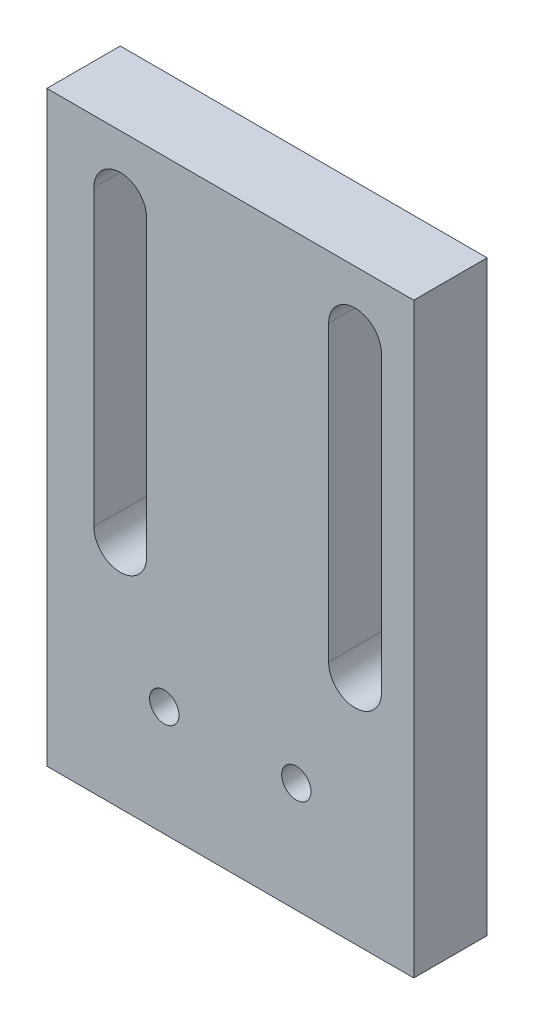
ISO-10303-21;
HEADER;
FILE_DESCRIPTION(('STEP AP214'),'2;1');
FILE_NAME('part.step','',(''),(''),'','','');
FILE_SCHEMA(('AUTOMOTIVE_DESIGN { 1 0 10303 214 1 1 1 1 }'));
ENDSEC;
DATA;
#1=APPLICATION_CONTEXT('core data for automotive mechanical design processes');
#2=APPLICATION_PROTOCOL_DEFINITION('international standard','automotive_design',2000,#1);
#3=PRODUCT_CONTEXT('',#1,'mechanical');
#4=PRODUCT('Part','Part','',(#3));
#5=PRODUCT_RELATED_PRODUCT_CATEGORY('part','',(#4));
#6=PRODUCT_DEFINITION_FORMATION('','',#4);
#7=PRODUCT_DEFINITION_CONTEXT('part definition',#1,'design');
#8=PRODUCT_DEFINITION('design','',#6,#7);
#9=PRODUCT_DEFINITION_SHAPE('','',#8);
#10=(LENGTH_UNIT() NAMED_UNIT(*) SI_UNIT(.MILLI.,.METRE.));
#11=(NAMED_UNIT(*) PLANE_ANGLE_UNIT() SI_UNIT($,.RADIAN.));
#12=(NAMED_UNIT(*) SI_UNIT($,.STERADIAN.) SOLID_ANGLE_UNIT());
#13=UNCERTAINTY_MEASURE_WITH_UNIT(LENGTH_MEASURE(1.E-05),#10,'distance_accuracy_value','');
#14=(GEOMETRIC_REPRESENTATION_CONTEXT(3) GLOBAL_UNCERTAINTY_ASSIGNED_CONTEXT((#13)) GLOBAL_UNIT_ASSIGNED_CONTEXT((#10,
#11,#12)) REPRESENTATION_CONTEXT('',''));
#15=CARTESIAN_POINT('',(0.,0.,0.));
#16=DIRECTION('',(0.,0.,1.));
#17=DIRECTION('',(1.,0.,0.));
#18=AXIS2_PLACEMENT_3D('',#15,#16,#17);
#19=CARTESIAN_POINT('',(-4.99999999999999,-4.24721189591077,5.));
#20=DIRECTION('',(0.,0.,-1.));
#21=DIRECTION('',(-1.,0.,0.));
#22=AXIS2_PLACEMENT_3D('',#19,#20,#21);
#23=CYLINDRICAL_SURFACE('',#22,1.);
#24=CARTESIAN_POINT('',(-4.99999999999999,-4.24721189591077,5.));
#25=DIRECTION('',(0.,0.,1.));
#26=DIRECTION('',(1.,0.,0.));
#27=AXIS2_PLACEMENT_3D('',#24,#25,#26);
#28=CIRCLE('',#27,1.);
#29=CARTESIAN_POINT('',(-3.99999999999999,-4.24721189591077,5.));
#30=VERTEX_POINT('',#29);
#31=EDGE_CURVE('E306',#30,#30,#28,.T.);
#32=ORIENTED_EDGE('',*,*,#31,.T.);
#33=EDGE_LOOP('',(#32));
#34=FACE_BOUND('',#33,.T.);
#35=CARTESIAN_POINT('',(-4.99999999999999,-4.24721189591077,2.5));
#36=DIRECTION('',(0.,0.,-1.));
#37=DIRECTION('',(-1.,0.,0.));
#38=AXIS2_PLACEMENT_3D('',#35,#36,#37);
#39=CIRCLE('',#38,1.);
#40=CARTESIAN_POINT('',(-5.99999999999999,-4.24721189591077,2.5));
#41=VERTEX_POINT('',#40);
#42=EDGE_CURVE('E37',#41,#41,#39,.T.);
#43=ORIENTED_EDGE('',*,*,#42,.T.);
#44=EDGE_LOOP('',(#43));
#45=FACE_BOUND('',#44,.T.);
#46=ADVANCED_FACE('F33',(#34,#45),#23,.F.);
#47=CARTESIAN_POINT('',(4.00000000000001,-4.24721189591077,5.));
#48=DIRECTION('',(0.,0.,-1.));
#49=DIRECTION('',(-1.,0.,0.));
#50=AXIS2_PLACEMENT_3D('',#47,#48,#49);
#51=CYLINDRICAL_SURFACE('',#50,1.);
#52=CARTESIAN_POINT('',(4.00000000000001,-4.24721189591077,5.));
#53=DIRECTION('',(0.,0.,1.));
#54=DIRECTION('',(1.,0.,0.));
#55=AXIS2_PLACEMENT_3D('',#52,#53,#54);
#56=CIRCLE('',#55,1.);
#57=CARTESIAN_POINT('',(5.00000000000001,-4.24721189591077,5.));
#58=VERTEX_POINT('',#57);
#59=EDGE_CURVE('E303',#58,#58,#56,.T.);
#60=ORIENTED_EDGE('',*,*,#59,.T.);
#61=EDGE_LOOP('',(#60));
#62=FACE_BOUND('',#61,.T.);
#63=CARTESIAN_POINT('',(4.00000000000001,-4.24721189591077,2.5));
#64=DIRECTION('',(0.,0.,-1.));
#65=DIRECTION('',(-1.,0.,0.));
#66=AXIS2_PLACEMENT_3D('',#63,#64,#65);
#67=CIRCLE('',#66,1.);
#68=CARTESIAN_POINT('',(3.00000000000001,-4.24721189591077,2.5));
#69=VERTEX_POINT('',#68);
#70=EDGE_CURVE('E235',#69,#69,#67,.T.);
#71=ORIENTED_EDGE('',*,*,#70,.T.);
#72=EDGE_LOOP('',(#71));
#73=FACE_BOUND('',#72,.T.);
#74=ADVANCED_FACE('F337',(#62,#73),#51,.F.);
#75=CARTESIAN_POINT('',(0.,0.,5.));
#76=DIRECTION('',(0.,0.,1.));
#77=DIRECTION('',(1.,0.,0.));
#78=AXIS2_PLACEMENT_3D('',#75,#76,#77);
#79=PLANE('',#78);
#80=ORIENTED_EDGE('',*,*,#31,.F.);
#81=EDGE_LOOP('',(#80));
#82=FACE_BOUND('',#81,.T.);
#83=DIRECTION('',(0.,-1.,0.));
#84=VECTOR('',#83,1.);
#85=CARTESIAN_POINT('',(-13.,28.2527881040892,5.));
#86=LINE('',#85,#84);
#87=CARTESIAN_POINT('',(-13.,28.2527881040892,5.));
#88=VERTEX_POINT('',#87);
#89=CARTESIAN_POINT('',(-13.,-11.7472118959108,5.));
#90=VERTEX_POINT('',#89);
#91=EDGE_CURVE('E310',#88,#90,#86,.T.);
#92=ORIENTED_EDGE('',*,*,#91,.T.);
#93=DIRECTION('',(1.,0.,0.));
#94=VECTOR('',#93,1.);
#95=CARTESIAN_POINT('',(-13.,-11.7472118959108,5.));
#96=LINE('',#95,#94);
#97=CARTESIAN_POINT('',(12.,-11.7472118959108,5.));
#98=VERTEX_POINT('',#97);
#99=EDGE_CURVE('E313',#90,#98,#96,.T.);
#100=ORIENTED_EDGE('',*,*,#99,.T.);
#101=DIRECTION('',(0.,1.,0.));
#102=VECTOR('',#101,1.);
#103=CARTESIAN_POINT('',(12.,28.2527881040892,5.));
#104=LINE('',#103,#102);
#105=CARTESIAN_POINT('',(12.,28.2527881040892,5.));
#106=VERTEX_POINT('',#105);
#107=EDGE_CURVE('E316',#98,#106,#104,.T.);
#108=ORIENTED_EDGE('',*,*,#107,.T.);
#109=DIRECTION('',(-1.,0.,0.));
#110=VECTOR('',#109,1.);
#111=CARTESIAN_POINT('',(-13.,28.2527881040892,5.));
#112=LINE('',#111,#110);
#113=EDGE_CURVE('E318',#106,#88,#112,.T.);
#114=ORIENTED_EDGE('',*,*,#113,.T.);
#115=EDGE_LOOP('',(#92,#100,#108,#114));
#116=FACE_BOUND('',#115,.T.);
#117=ORIENTED_EDGE('',*,*,#59,.F.);
#118=EDGE_LOOP('',(#117));
#119=FACE_BOUND('',#118,.T.);
#120=DIRECTION('',(0.,-1.,0.));
#121=VECTOR('',#120,1.);
#122=CARTESIAN_POINT('',(-9.8,23.9935041029267,5.));
#123=LINE('',#122,#121);
#124=CARTESIAN_POINT('',(-9.8,23.9935041029267,5.));
#125=VERTEX_POINT('',#124);
#126=CARTESIAN_POINT('',(-9.8,3.99350410292669,5.));
#127=VERTEX_POINT('',#126);
#128=EDGE_CURVE('E275',#125,#127,#123,.T.);
#129=ORIENTED_EDGE('',*,*,#128,.F.);
#130=CARTESIAN_POINT('',(-8.,23.9935041029267,5.));
#131=DIRECTION('',(0.,0.,1.));
#132=DIRECTION('',(1.,0.,0.));
#133=AXIS2_PLACEMENT_3D('',#130,#131,#132);
#134=CIRCLE('',#133,1.8);
#135=CARTESIAN_POINT('',(-6.2,23.9935041029267,5.));
#136=VERTEX_POINT('',#135);
#137=EDGE_CURVE('E273',#136,#125,#134,.T.);
#138=ORIENTED_EDGE('',*,*,#137,.F.);
#139=DIRECTION('',(0.,1.,0.));
#140=VECTOR('',#139,1.);
#141=CARTESIAN_POINT('',(-6.2,23.9935041029267,5.));
#142=LINE('',#141,#140);
#143=CARTESIAN_POINT('',(-6.19999999999999,3.99350410292669,5.));
#144=VERTEX_POINT('',#143);
#145=EDGE_CURVE('E281',#144,#136,#142,.T.);
#146=ORIENTED_EDGE('',*,*,#145,.F.);
#147=CARTESIAN_POINT('',(-7.99999999999999,3.99350410292669,5.));
#148=DIRECTION('',(0.,0.,1.));
#149=DIRECTION('',(1.,0.,0.));
#150=AXIS2_PLACEMENT_3D('',#147,#148,#149);
#151=CIRCLE('',#150,1.8);
#152=EDGE_CURVE('E278',#127,#144,#151,.T.);
#153=ORIENTED_EDGE('',*,*,#152,.F.);
#154=EDGE_LOOP('',(#129,#138,#146,#153));
#155=FACE_BOUND('',#154,.T.);
#156=DIRECTION('',(0.,-1.,0.));
#157=VECTOR('',#156,1.);
#158=CARTESIAN_POINT('',(6.2,23.9935041029267,5.));
#159=LINE('',#158,#157);
#160=CARTESIAN_POINT('',(6.2,23.9935041029267,5.));
#161=VERTEX_POINT('',#160);
#162=CARTESIAN_POINT('',(6.2,3.99350410292669,5.));
#163=VERTEX_POINT('',#162);
#164=EDGE_CURVE('E243',#161,#163,#159,.T.);
#165=ORIENTED_EDGE('',*,*,#164,.F.);
#166=CARTESIAN_POINT('',(8.,23.9935041029267,5.));
#167=DIRECTION('',(0.,0.,1.));
#168=DIRECTION('',(-1.,0.,0.));
#169=AXIS2_PLACEMENT_3D('',#166,#167,#168);
#170=CIRCLE('',#169,1.8);
#171=CARTESIAN_POINT('',(9.8,23.9935041029267,5.));
#172=VERTEX_POINT('',#171);
#173=EDGE_CURVE('E241',#172,#161,#170,.T.);
#174=ORIENTED_EDGE('',*,*,#173,.F.);
#175=DIRECTION('',(0.,1.,0.));
#176=VECTOR('',#175,1.);
#177=CARTESIAN_POINT('',(9.8,23.9935041029267,5.));
#178=LINE('',#177,#176);
#179=CARTESIAN_POINT('',(9.8,3.99350410292669,5.));
#180=VERTEX_POINT('',#179);
#181=EDGE_CURVE('E249',#180,#172,#178,.T.);
#182=ORIENTED_EDGE('',*,*,#181,.F.);
#183=CARTESIAN_POINT('',(8.,3.99350410292669,5.));
#184=DIRECTION('',(0.,0.,1.));
#185=DIRECTION('',(-1.,0.,0.));
#186=AXIS2_PLACEMENT_3D('',#183,#184,#185);
#187=CIRCLE('',#186,1.8);
#188=EDGE_CURVE('E246',#163,#180,#187,.T.);
#189=ORIENTED_EDGE('',*,*,#188,.F.);
#190=EDGE_LOOP('',(#165,#174,#182,#189));
#191=FACE_BOUND('',#190,.T.);
#192=ADVANCED_FACE('F361',(#82,#116,#119,#155,#191),#79,.T.);
#193=CARTESIAN_POINT('',(0.,0.,0.));
#194=DIRECTION('',(0.,0.,1.));
#195=DIRECTION('',(1.,0.,0.));
#196=AXIS2_PLACEMENT_3D('',#193,#194,#195);
#197=PLANE('',#196);
#198=DIRECTION('',(1.,0.,0.));
#199=VECTOR('',#198,1.);
#200=CARTESIAN_POINT('',(-1.89999999999999,-1.14721189591077,0.));
#201=LINE('',#200,#199);
#202=CARTESIAN_POINT('',(-8.09999999999999,-1.14721189591077,0.));
#203=VERTEX_POINT('',#202);
#204=CARTESIAN_POINT('',(-1.89999999999999,-1.14721189591077,0.));
#205=VERTEX_POINT('',#204);
#206=EDGE_CURVE('E201',#203,#205,#201,.T.);
#207=ORIENTED_EDGE('',*,*,#206,.F.);
#208=DIRECTION('',(0.,1.,0.));
#209=VECTOR('',#208,1.);
#210=CARTESIAN_POINT('',(-8.09999999999999,-1.14721189591077,0.));
#211=LINE('',#210,#209);
#212=CARTESIAN_POINT('',(-8.09999999999999,-7.34721189591077,0.));
#213=VERTEX_POINT('',#212);
#214=EDGE_CURVE('E50',#213,#203,#211,.T.);
#215=ORIENTED_EDGE('',*,*,#214,.F.);
#216=DIRECTION('',(-1.,0.,0.));
#217=VECTOR('',#216,1.);
#218=CARTESIAN_POINT('',(-1.9,-7.34721189591077,0.));
#219=LINE('',#218,#217);
#220=CARTESIAN_POINT('',(-1.9,-7.34721189591077,0.));
#221=VERTEX_POINT('',#220);
#222=EDGE_CURVE('E192',#221,#213,#219,.T.);
#223=ORIENTED_EDGE('',*,*,#222,.F.);
#224=DIRECTION('',(0.,-1.,0.));
#225=VECTOR('',#224,1.);
#226=CARTESIAN_POINT('',(-1.89999999999999,-1.14721189591077,0.));
#227=LINE('',#226,#225);
#228=EDGE_CURVE('E195',#205,#221,#227,.T.);
#229=ORIENTED_EDGE('',*,*,#228,.F.);
#230=EDGE_LOOP('',(#207,#215,#223,#229));
#231=FACE_BOUND('',#230,.T.);
#232=DIRECTION('',(1.,0.,0.));
#233=VECTOR('',#232,1.);
#234=CARTESIAN_POINT('',(7.10000000000001,-1.14721189591077,0.));
#235=LINE('',#234,#233);
#236=CARTESIAN_POINT('',(0.900000000000006,-1.14721189591077,0.));
#237=VERTEX_POINT('',#236);
#238=CARTESIAN_POINT('',(7.10000000000001,-1.14721189591077,0.));
#239=VERTEX_POINT('',#238);
#240=EDGE_CURVE('E225',#237,#239,#235,.T.);
#241=ORIENTED_EDGE('',*,*,#240,.F.);
#242=DIRECTION('',(0.,1.,0.));
#243=VECTOR('',#242,1.);
#244=CARTESIAN_POINT('',(0.900000000000006,-1.14721189591077,0.));
#245=LINE('',#244,#243);
#246=CARTESIAN_POINT('',(0.900000000000005,-7.34721189591077,0.));
#247=VERTEX_POINT('',#246);
#248=EDGE_CURVE('E58',#247,#237,#245,.T.);
#249=ORIENTED_EDGE('',*,*,#248,.F.);
#250=DIRECTION('',(-1.,0.,0.));
#251=VECTOR('',#250,1.);
#252=CARTESIAN_POINT('',(7.1,-7.34721189591077,0.));
#253=LINE('',#252,#251);
#254=CARTESIAN_POINT('',(7.1,-7.34721189591077,0.));
#255=VERTEX_POINT('',#254);
#256=EDGE_CURVE('E214',#255,#247,#253,.T.);
#257=ORIENTED_EDGE('',*,*,#256,.F.);
#258=DIRECTION('',(0.,-1.,0.));
#259=VECTOR('',#258,1.);
#260=CARTESIAN_POINT('',(7.10000000000001,-1.14721189591077,0.));
#261=LINE('',#260,#259);
#262=EDGE_CURVE('E228',#239,#255,#261,.T.);
#263=ORIENTED_EDGE('',*,*,#262,.F.);
#264=EDGE_LOOP('',(#241,#249,#257,#263));
#265=FACE_BOUND('',#264,.T.);
#266=CARTESIAN_POINT('',(-8.,23.9935041029267,0.));
#267=DIRECTION('',(0.,0.,1.));
#268=DIRECTION('',(1.,0.,0.));
#269=AXIS2_PLACEMENT_3D('',#266,#267,#268);
#270=CIRCLE('',#269,1.8);
#271=CARTESIAN_POINT('',(-6.2,23.9935041029267,0.));
#272=VERTEX_POINT('',#271);
#273=CARTESIAN_POINT('',(-9.8,23.9935041029267,0.));
#274=VERTEX_POINT('',#273);
#275=EDGE_CURVE('E272',#272,#274,#270,.T.);
#276=ORIENTED_EDGE('',*,*,#275,.T.);
#277=DIRECTION('',(0.,-1.,0.));
#278=VECTOR('',#277,1.);
#279=CARTESIAN_POINT('',(-9.8,23.9935041029267,0.));
#280=LINE('',#279,#278);
#281=CARTESIAN_POINT('',(-9.8,3.99350410292669,0.));
#282=VERTEX_POINT('',#281);
#283=EDGE_CURVE('E286',#274,#282,#280,.T.);
#284=ORIENTED_EDGE('',*,*,#283,.T.);
#285=CARTESIAN_POINT('',(-7.99999999999999,3.99350410292669,0.));
#286=DIRECTION('',(0.,0.,1.));
#287=DIRECTION('',(1.,0.,0.));
#288=AXIS2_PLACEMENT_3D('',#285,#286,#287);
#289=CIRCLE('',#288,1.8);
#290=CARTESIAN_POINT('',(-6.19999999999999,3.99350410292669,0.));
#291=VERTEX_POINT('',#290);
#292=EDGE_CURVE('E289',#282,#291,#289,.T.);
#293=ORIENTED_EDGE('',*,*,#292,.T.);
#294=DIRECTION('',(0.,1.,0.));
#295=VECTOR('',#294,1.);
#296=CARTESIAN_POINT('',(-6.2,23.9935041029267,0.));
#297=LINE('',#296,#295);
#298=EDGE_CURVE('E276',#291,#272,#297,.T.);
#299=ORIENTED_EDGE('',*,*,#298,.T.);
#300=EDGE_LOOP('',(#276,#284,#293,#299));
#301=FACE_BOUND('',#300,.T.);
#302=DIRECTION('',(0.,-1.,0.));
#303=VECTOR('',#302,1.);
#304=CARTESIAN_POINT('',(-13.,28.2527881040892,0.));
#305=LINE('',#304,#303);
#306=CARTESIAN_POINT('',(-13.,28.2527881040892,0.));
#307=VERTEX_POINT('',#306);
#308=CARTESIAN_POINT('',(-13.,-11.7472118959108,0.));
#309=VERTEX_POINT('',#308);
#310=EDGE_CURVE('E309',#307,#309,#305,.T.);
#311=ORIENTED_EDGE('',*,*,#310,.F.);
#312=DIRECTION('',(-1.,0.,0.));
#313=VECTOR('',#312,1.);
#314=CARTESIAN_POINT('',(-13.,28.2527881040892,0.));
#315=LINE('',#314,#313);
#316=CARTESIAN_POINT('',(12.,28.2527881040892,0.));
#317=VERTEX_POINT('',#316);
#318=EDGE_CURVE('E314',#317,#307,#315,.T.);
#319=ORIENTED_EDGE('',*,*,#318,.F.);
#320=DIRECTION('',(0.,1.,0.));
#321=VECTOR('',#320,1.);
#322=CARTESIAN_POINT('',(12.,28.2527881040892,0.));
#323=LINE('',#322,#321);
#324=CARTESIAN_POINT('',(12.,-11.7472118959108,0.));
#325=VERTEX_POINT('',#324);
#326=EDGE_CURVE('E325',#325,#317,#323,.T.);
#327=ORIENTED_EDGE('',*,*,#326,.F.);
#328=DIRECTION('',(1.,0.,0.));
#329=VECTOR('',#328,1.);
#330=CARTESIAN_POINT('',(-13.,-11.7472118959108,0.));
#331=LINE('',#330,#329);
#332=EDGE_CURVE('E323',#309,#325,#331,.T.);
#333=ORIENTED_EDGE('',*,*,#332,.F.);
#334=EDGE_LOOP('',(#311,#319,#327,#333));
#335=FACE_BOUND('',#334,.T.);
#336=CARTESIAN_POINT('',(8.,23.9935041029267,0.));
#337=DIRECTION('',(0.,0.,1.));
#338=DIRECTION('',(-1.,0.,0.));
#339=AXIS2_PLACEMENT_3D('',#336,#337,#338);
#340=CIRCLE('',#339,1.8);
#341=CARTESIAN_POINT('',(9.8,23.9935041029267,0.));
#342=VERTEX_POINT('',#341);
#343=CARTESIAN_POINT('',(6.2,23.9935041029267,0.));
#344=VERTEX_POINT('',#343);
#345=EDGE_CURVE('E252',#342,#344,#340,.T.);
#346=ORIENTED_EDGE('',*,*,#345,.T.);
#347=DIRECTION('',(0.,-1.,0.));
#348=VECTOR('',#347,1.);
#349=CARTESIAN_POINT('',(6.2,23.9935041029267,0.));
#350=LINE('',#349,#348);
#351=CARTESIAN_POINT('',(6.2,3.99350410292669,0.));
#352=VERTEX_POINT('',#351);
#353=EDGE_CURVE('E255',#344,#352,#350,.T.);
#354=ORIENTED_EDGE('',*,*,#353,.T.);
#355=CARTESIAN_POINT('',(8.,3.99350410292669,0.));
#356=DIRECTION('',(0.,0.,1.));
#357=DIRECTION('',(-1.,0.,0.));
#358=AXIS2_PLACEMENT_3D('',#355,#356,#357);
#359=CIRCLE('',#358,1.8);
#360=CARTESIAN_POINT('',(9.8,3.99350410292669,0.));
#361=VERTEX_POINT('',#360);
#362=EDGE_CURVE('E258',#352,#361,#359,.T.);
#363=ORIENTED_EDGE('',*,*,#362,.T.);
#364=DIRECTION('',(0.,1.,0.));
#365=VECTOR('',#364,1.);
#366=CARTESIAN_POINT('',(9.8,23.9935041029267,0.));
#367=LINE('',#366,#365);
#368=EDGE_CURVE('E244',#361,#342,#367,.T.);
#369=ORIENTED_EDGE('',*,*,#368,.T.);
#370=EDGE_LOOP('',(#346,#354,#363,#369));
#371=FACE_BOUND('',#370,.T.);
#372=ADVANCED_FACE('F358',(#231,#265,#301,#335,#371),#197,.F.);
#373=CARTESIAN_POINT('',(-13.,28.2527881040892,5.));
#374=DIRECTION('',(1.,0.,0.));
#375=DIRECTION('',(0.,1.,0.));
#376=AXIS2_PLACEMENT_3D('',#373,#374,#375);
#377=PLANE('',#376);
#378=ORIENTED_EDGE('',*,*,#310,.T.);
#379=DIRECTION('',(0.,0.,-1.));
#380=VECTOR('',#379,1.);
#381=CARTESIAN_POINT('',(-13.,-11.7472118959108,5.));
#382=LINE('',#381,#380);
#383=EDGE_CURVE('E11',#90,#309,#382,.T.);
#384=ORIENTED_EDGE('',*,*,#383,.F.);
#385=ORIENTED_EDGE('',*,*,#91,.F.);
#386=DIRECTION('',(0.,0.,-1.));
#387=VECTOR('',#386,1.);
#388=CARTESIAN_POINT('',(-13.,28.2527881040892,5.));
#389=LINE('',#388,#387);
#390=EDGE_CURVE('E320',#88,#307,#389,.T.);
#391=ORIENTED_EDGE('',*,*,#390,.T.);
#392=EDGE_LOOP('',(#378,#384,#385,#391));
#393=FACE_BOUND('',#392,.T.);
#394=ADVANCED_FACE('F35',(#393),#377,.F.);
#395=CARTESIAN_POINT('',(-13.,-11.7472118959108,5.));
#396=DIRECTION('',(0.,1.,0.));
#397=DIRECTION('',(-1.,0.,0.));
#398=AXIS2_PLACEMENT_3D('',#395,#396,#397);
#399=PLANE('',#398);
#400=ORIENTED_EDGE('',*,*,#332,.T.);
#401=DIRECTION('',(0.,0.,-1.));
#402=VECTOR('',#401,1.);
#403=CARTESIAN_POINT('',(12.,-11.7472118959108,5.));
#404=LINE('',#403,#402);
#405=EDGE_CURVE('E42',#98,#325,#404,.T.);
#406=ORIENTED_EDGE('',*,*,#405,.F.);
#407=ORIENTED_EDGE('',*,*,#99,.F.);
#408=ORIENTED_EDGE('',*,*,#383,.T.);
#409=EDGE_LOOP('',(#400,#406,#407,#408));
#410=FACE_BOUND('',#409,.T.);
#411=ADVANCED_FACE('F415',(#410),#399,.F.);
#412=CARTESIAN_POINT('',(12.,28.2527881040892,5.));
#413=DIRECTION('',(-1.,0.,0.));
#414=DIRECTION('',(0.,-1.,0.));
#415=AXIS2_PLACEMENT_3D('',#412,#413,#414);
#416=PLANE('',#415);
#417=ORIENTED_EDGE('',*,*,#326,.T.);
#418=DIRECTION('',(0.,0.,-1.));
#419=VECTOR('',#418,1.);
#420=CARTESIAN_POINT('',(12.,28.2527881040892,5.));
#421=LINE('',#420,#419);
#422=EDGE_CURVE('E330',#106,#317,#421,.T.);
#423=ORIENTED_EDGE('',*,*,#422,.F.);
#424=ORIENTED_EDGE('',*,*,#107,.F.);
#425=ORIENTED_EDGE('',*,*,#405,.T.);
#426=EDGE_LOOP('',(#417,#423,#424,#425));
#427=FACE_BOUND('',#426,.T.);
#428=ADVANCED_FACE('F412',(#427),#416,.F.);
#429=CARTESIAN_POINT('',(-13.,28.2527881040892,5.));
#430=DIRECTION('',(0.,-1.,0.));
#431=DIRECTION('',(1.,0.,0.));
#432=AXIS2_PLACEMENT_3D('',#429,#430,#431);
#433=PLANE('',#432);
#434=ORIENTED_EDGE('',*,*,#318,.T.);
#435=ORIENTED_EDGE('',*,*,#390,.F.);
#436=ORIENTED_EDGE('',*,*,#113,.F.);
#437=ORIENTED_EDGE('',*,*,#422,.T.);
#438=EDGE_LOOP('',(#434,#435,#436,#437));
#439=FACE_BOUND('',#438,.T.);
#440=ADVANCED_FACE('F408',(#439),#433,.F.);
#441=CARTESIAN_POINT('',(-8.,23.9935041029267,5.));
#442=DIRECTION('',(0.,0.,-1.));
#443=DIRECTION('',(-1.,0.,0.));
#444=AXIS2_PLACEMENT_3D('',#441,#442,#443);
#445=CYLINDRICAL_SURFACE('',#444,1.8);
#446=ORIENTED_EDGE('',*,*,#275,.F.);
#447=DIRECTION('',(0.,0.,-1.));
#448=VECTOR('',#447,1.);
#449=CARTESIAN_POINT('',(-6.2,23.9935041029267,5.));
#450=LINE('',#449,#448);
#451=EDGE_CURVE('E283',#136,#272,#450,.T.);
#452=ORIENTED_EDGE('',*,*,#451,.F.);
#453=ORIENTED_EDGE('',*,*,#137,.T.);
#454=DIRECTION('',(0.,0.,-1.));
#455=VECTOR('',#454,1.);
#456=CARTESIAN_POINT('',(-9.8,23.9935041029267,5.));
#457=LINE('',#456,#455);
#458=EDGE_CURVE('E300',#125,#274,#457,.T.);
#459=ORIENTED_EDGE('',*,*,#458,.T.);
#460=EDGE_LOOP('',(#446,#452,#453,#459));
#461=FACE_BOUND('',#460,.T.);
#462=ADVANCED_FACE('F411',(#461),#445,.F.);
#463=CARTESIAN_POINT('',(-9.8,23.9935041029267,5.));
#464=DIRECTION('',(1.,0.,0.));
#465=DIRECTION('',(0.,1.,0.));
#466=AXIS2_PLACEMENT_3D('',#463,#464,#465);
#467=PLANE('',#466);
#468=ORIENTED_EDGE('',*,*,#283,.F.);
#469=ORIENTED_EDGE('',*,*,#458,.F.);
#470=ORIENTED_EDGE('',*,*,#128,.T.);
#471=DIRECTION('',(0.,0.,-1.));
#472=VECTOR('',#471,1.);
#473=CARTESIAN_POINT('',(-9.8,3.99350410292669,5.));
#474=LINE('',#473,#472);
#475=EDGE_CURVE('E298',#127,#282,#474,.T.);
#476=ORIENTED_EDGE('',*,*,#475,.T.);
#477=EDGE_LOOP('',(#468,#469,#470,#476));
#478=FACE_BOUND('',#477,.T.);
#479=ADVANCED_FACE('F442',(#478),#467,.T.);
#480=CARTESIAN_POINT('',(-7.99999999999999,3.99350410292669,5.));
#481=DIRECTION('',(0.,0.,-1.));
#482=DIRECTION('',(-1.,0.,0.));
#483=AXIS2_PLACEMENT_3D('',#480,#481,#482);
#484=CYLINDRICAL_SURFACE('',#483,1.8);
#485=ORIENTED_EDGE('',*,*,#292,.F.);
#486=ORIENTED_EDGE('',*,*,#475,.F.);
#487=ORIENTED_EDGE('',*,*,#152,.T.);
#488=DIRECTION('',(0.,0.,-1.));
#489=VECTOR('',#488,1.);
#490=CARTESIAN_POINT('',(-6.19999999999999,3.99350410292669,5.));
#491=LINE('',#490,#489);
#492=EDGE_CURVE('E296',#144,#291,#491,.T.);
#493=ORIENTED_EDGE('',*,*,#492,.T.);
#494=EDGE_LOOP('',(#485,#486,#487,#493));
#495=FACE_BOUND('',#494,.T.);
#496=ADVANCED_FACE('F445',(#495),#484,.F.);
#497=CARTESIAN_POINT('',(-6.2,23.9935041029267,5.));
#498=DIRECTION('',(-1.,0.,0.));
#499=DIRECTION('',(0.,-1.,0.));
#500=AXIS2_PLACEMENT_3D('',#497,#498,#499);
#501=PLANE('',#500);
#502=ORIENTED_EDGE('',*,*,#298,.F.);
#503=ORIENTED_EDGE('',*,*,#492,.F.);
#504=ORIENTED_EDGE('',*,*,#145,.T.);
#505=ORIENTED_EDGE('',*,*,#451,.T.);
#506=EDGE_LOOP('',(#502,#503,#504,#505));
#507=FACE_BOUND('',#506,.T.);
#508=ADVANCED_FACE('F450',(#507),#501,.T.);
#509=CARTESIAN_POINT('',(8.,23.9935041029267,5.));
#510=DIRECTION('',(0.,0.,-1.));
#511=DIRECTION('',(-1.,0.,0.));
#512=AXIS2_PLACEMENT_3D('',#509,#510,#511);
#513=CYLINDRICAL_SURFACE('',#512,1.8);
#514=ORIENTED_EDGE('',*,*,#345,.F.);
#515=DIRECTION('',(0.,0.,-1.));
#516=VECTOR('',#515,1.);
#517=CARTESIAN_POINT('',(9.8,23.9935041029267,5.));
#518=LINE('',#517,#516);
#519=EDGE_CURVE('E251',#172,#342,#518,.T.);
#520=ORIENTED_EDGE('',*,*,#519,.F.);
#521=ORIENTED_EDGE('',*,*,#173,.T.);
#522=DIRECTION('',(0.,0.,-1.));
#523=VECTOR('',#522,1.);
#524=CARTESIAN_POINT('',(6.2,23.9935041029267,5.));
#525=LINE('',#524,#523);
#526=EDGE_CURVE('E269',#161,#344,#525,.T.);
#527=ORIENTED_EDGE('',*,*,#526,.T.);
#528=EDGE_LOOP('',(#514,#520,#521,#527));
#529=FACE_BOUND('',#528,.T.);
#530=ADVANCED_FACE('F371',(#529),#513,.F.);
#531=CARTESIAN_POINT('',(6.2,23.9935041029267,5.));
#532=DIRECTION('',(1.,0.,0.));
#533=DIRECTION('',(0.,1.,0.));
#534=AXIS2_PLACEMENT_3D('',#531,#532,#533);
#535=PLANE('',#534);
#536=ORIENTED_EDGE('',*,*,#353,.F.);
#537=ORIENTED_EDGE('',*,*,#526,.F.);
#538=ORIENTED_EDGE('',*,*,#164,.T.);
#539=DIRECTION('',(0.,0.,-1.));
#540=VECTOR('',#539,1.);
#541=CARTESIAN_POINT('',(6.2,3.99350410292669,5.));
#542=LINE('',#541,#540);
#543=EDGE_CURVE('E267',#163,#352,#542,.T.);
#544=ORIENTED_EDGE('',*,*,#543,.T.);
#545=EDGE_LOOP('',(#536,#537,#538,#544));
#546=FACE_BOUND('',#545,.T.);
#547=ADVANCED_FACE('F381',(#546),#535,.T.);
#548=CARTESIAN_POINT('',(8.,3.99350410292669,5.));
#549=DIRECTION('',(0.,0.,-1.));
#550=DIRECTION('',(-1.,0.,0.));
#551=AXIS2_PLACEMENT_3D('',#548,#549,#550);
#552=CYLINDRICAL_SURFACE('',#551,1.8);
#553=ORIENTED_EDGE('',*,*,#362,.F.);
#554=ORIENTED_EDGE('',*,*,#543,.F.);
#555=ORIENTED_EDGE('',*,*,#188,.T.);
#556=DIRECTION('',(0.,0.,-1.));
#557=VECTOR('',#556,1.);
#558=CARTESIAN_POINT('',(9.8,3.99350410292669,5.));
#559=LINE('',#558,#557);
#560=EDGE_CURVE('E265',#180,#361,#559,.T.);
#561=ORIENTED_EDGE('',*,*,#560,.T.);
#562=EDGE_LOOP('',(#553,#554,#555,#561));
#563=FACE_BOUND('',#562,.T.);
#564=ADVANCED_FACE('F385',(#563),#552,.F.);
#565=CARTESIAN_POINT('',(9.8,23.9935041029267,5.));
#566=DIRECTION('',(-1.,0.,0.));
#567=DIRECTION('',(0.,-1.,0.));
#568=AXIS2_PLACEMENT_3D('',#565,#566,#567);
#569=PLANE('',#568);
#570=ORIENTED_EDGE('',*,*,#368,.F.);
#571=ORIENTED_EDGE('',*,*,#560,.F.);
#572=ORIENTED_EDGE('',*,*,#181,.T.);
#573=ORIENTED_EDGE('',*,*,#519,.T.);
#574=EDGE_LOOP('',(#570,#571,#572,#573));
#575=FACE_BOUND('',#574,.T.);
#576=ADVANCED_FACE('F375',(#575),#569,.T.);
#577=CARTESIAN_POINT('',(0.900000000000006,-1.14721189591077,2.5));
#578=DIRECTION('',(-1.,0.,0.));
#579=DIRECTION('',(0.,-1.,0.));
#580=AXIS2_PLACEMENT_3D('',#577,#578,#579);
#581=PLANE('',#580);
#582=ORIENTED_EDGE('',*,*,#248,.T.);
#583=DIRECTION('',(0.,0.,-1.));
#584=VECTOR('',#583,1.);
#585=CARTESIAN_POINT('',(0.900000000000006,-1.14721189591077,2.5));
#586=LINE('',#585,#584);
#587=CARTESIAN_POINT('',(0.900000000000006,-1.14721189591077,2.5));
#588=VERTEX_POINT('',#587);
#589=EDGE_CURVE('E223',#588,#237,#586,.T.);
#590=ORIENTED_EDGE('',*,*,#589,.F.);
#591=DIRECTION('',(0.,1.,0.));
#592=VECTOR('',#591,1.);
#593=CARTESIAN_POINT('',(0.900000000000006,-1.14721189591077,2.5));
#594=LINE('',#593,#592);
#595=CARTESIAN_POINT('',(0.900000000000005,-7.34721189591077,2.5));
#596=VERTEX_POINT('',#595);
#597=EDGE_CURVE('E210',#596,#588,#594,.T.);
#598=ORIENTED_EDGE('',*,*,#597,.F.);
#599=DIRECTION('',(0.,0.,-1.));
#600=VECTOR('',#599,1.);
#601=CARTESIAN_POINT('',(0.900000000000005,-7.34721189591077,2.5));
#602=LINE('',#601,#600);
#603=EDGE_CURVE('E233',#596,#247,#602,.T.);
#604=ORIENTED_EDGE('',*,*,#603,.T.);
#605=EDGE_LOOP('',(#582,#590,#598,#604));
#606=FACE_BOUND('',#605,.T.);
#607=ADVANCED_FACE('F347',(#606),#581,.F.);
#608=CARTESIAN_POINT('',(7.1,-7.34721189591077,2.5));
#609=DIRECTION('',(0.,-1.,0.));
#610=DIRECTION('',(0.,0.,-1.));
#611=AXIS2_PLACEMENT_3D('',#608,#609,#610);
#612=PLANE('',#611);
#613=ORIENTED_EDGE('',*,*,#256,.T.);
#614=ORIENTED_EDGE('',*,*,#603,.F.);
#615=DIRECTION('',(-1.,0.,0.));
#616=VECTOR('',#615,1.);
#617=CARTESIAN_POINT('',(7.1,-7.34721189591077,2.5));
#618=LINE('',#617,#616);
#619=CARTESIAN_POINT('',(7.1,-7.34721189591077,2.5));
#620=VERTEX_POINT('',#619);
#621=EDGE_CURVE('E220',#620,#596,#618,.T.);
#622=ORIENTED_EDGE('',*,*,#621,.F.);
#623=DIRECTION('',(0.,0.,-1.));
#624=VECTOR('',#623,1.);
#625=CARTESIAN_POINT('',(7.1,-7.34721189591077,2.5));
#626=LINE('',#625,#624);
#627=EDGE_CURVE('E236',#620,#255,#626,.T.);
#628=ORIENTED_EDGE('',*,*,#627,.T.);
#629=EDGE_LOOP('',(#613,#614,#622,#628));
#630=FACE_BOUND('',#629,.T.);
#631=ADVANCED_FACE('F355',(#630),#612,.F.);
#632=CARTESIAN_POINT('',(7.10000000000001,-1.14721189591077,2.5));
#633=DIRECTION('',(1.,0.,0.));
#634=DIRECTION('',(0.,1.,0.));
#635=AXIS2_PLACEMENT_3D('',#632,#633,#634);
#636=PLANE('',#635);
#637=ORIENTED_EDGE('',*,*,#262,.T.);
#638=ORIENTED_EDGE('',*,*,#627,.F.);
#639=DIRECTION('',(0.,-1.,0.));
#640=VECTOR('',#639,1.);
#641=CARTESIAN_POINT('',(7.10000000000001,-1.14721189591077,2.5));
#642=LINE('',#641,#640);
#643=CARTESIAN_POINT('',(7.10000000000001,-1.14721189591077,2.5));
#644=VERTEX_POINT('',#643);
#645=EDGE_CURVE('E217',#644,#620,#642,.T.);
#646=ORIENTED_EDGE('',*,*,#645,.F.);
#647=DIRECTION('',(0.,0.,-1.));
#648=VECTOR('',#647,1.);
#649=CARTESIAN_POINT('',(7.10000000000001,-1.14721189591077,2.5));
#650=LINE('',#649,#648);
#651=EDGE_CURVE('E238',#644,#239,#650,.T.);
#652=ORIENTED_EDGE('',*,*,#651,.T.);
#653=EDGE_LOOP('',(#637,#638,#646,#652));
#654=FACE_BOUND('',#653,.T.);
#655=ADVANCED_FACE('F353',(#654),#636,.F.);
#656=CARTESIAN_POINT('',(7.10000000000001,-1.14721189591077,2.5));
#657=DIRECTION('',(0.,1.,0.));
#658=DIRECTION('',(0.,0.,1.));
#659=AXIS2_PLACEMENT_3D('',#656,#657,#658);
#660=PLANE('',#659);
#661=ORIENTED_EDGE('',*,*,#240,.T.);
#662=ORIENTED_EDGE('',*,*,#651,.F.);
#663=DIRECTION('',(1.,0.,0.));
#664=VECTOR('',#663,1.);
#665=CARTESIAN_POINT('',(7.10000000000001,-1.14721189591077,2.5));
#666=LINE('',#665,#664);
#667=EDGE_CURVE('E213',#588,#644,#666,.T.);
#668=ORIENTED_EDGE('',*,*,#667,.F.);
#669=ORIENTED_EDGE('',*,*,#589,.T.);
#670=EDGE_LOOP('',(#661,#662,#668,#669));
#671=FACE_BOUND('',#670,.T.);
#672=ADVANCED_FACE('F342',(#671),#660,.F.);
#673=CARTESIAN_POINT('',(0.,0.,2.5));
#674=DIRECTION('',(0.,0.,-1.));
#675=DIRECTION('',(-1.,0.,0.));
#676=AXIS2_PLACEMENT_3D('',#673,#674,#675);
#677=PLANE('',#676);
#678=ORIENTED_EDGE('',*,*,#70,.F.);
#679=EDGE_LOOP('',(#678));
#680=FACE_BOUND('',#679,.T.);
#681=ORIENTED_EDGE('',*,*,#597,.T.);
#682=ORIENTED_EDGE('',*,*,#667,.T.);
#683=ORIENTED_EDGE('',*,*,#645,.T.);
#684=ORIENTED_EDGE('',*,*,#621,.T.);
#685=EDGE_LOOP('',(#681,#682,#683,#684));
#686=FACE_BOUND('',#685,.T.);
#687=ADVANCED_FACE('F339',(#680,#686),#677,.T.);
#688=CARTESIAN_POINT('',(-8.09999999999999,-1.14721189591077,2.5));
#689=DIRECTION('',(-1.,0.,0.));
#690=DIRECTION('',(0.,0.,1.));
#691=AXIS2_PLACEMENT_3D('',#688,#689,#690);
#692=PLANE('',#691);
#693=ORIENTED_EDGE('',*,*,#214,.T.);
#694=DIRECTION('',(0.,0.,-1.));
#695=VECTOR('',#694,1.);
#696=CARTESIAN_POINT('',(-8.09999999999999,-1.14721189591077,2.5));
#697=LINE('',#696,#695);
#698=CARTESIAN_POINT('',(-8.09999999999999,-1.14721189591077,2.5));
#699=VERTEX_POINT('',#698);
#700=EDGE_CURVE('E170',#699,#203,#697,.T.);
#701=ORIENTED_EDGE('',*,*,#700,.F.);
#702=DIRECTION('',(0.,1.,0.));
#703=VECTOR('',#702,1.);
#704=CARTESIAN_POINT('',(-8.09999999999999,-1.14721189591077,2.5));
#705=LINE('',#704,#703);
#706=CARTESIAN_POINT('',(-8.09999999999999,-7.34721189591077,2.5));
#707=VERTEX_POINT('',#706);
#708=EDGE_CURVE('E174',#707,#699,#705,.T.);
#709=ORIENTED_EDGE('',*,*,#708,.F.);
#710=DIRECTION('',(0.,0.,-1.));
#711=VECTOR('',#710,1.);
#712=CARTESIAN_POINT('',(-8.09999999999999,-7.34721189591077,2.5));
#713=LINE('',#712,#711);
#714=EDGE_CURVE('E205',#707,#213,#713,.T.);
#715=ORIENTED_EDGE('',*,*,#714,.T.);
#716=EDGE_LOOP('',(#693,#701,#709,#715));
#717=FACE_BOUND('',#716,.T.);
#718=ADVANCED_FACE('F172',(#717),#692,.F.);
#719=CARTESIAN_POINT('',(-1.9,-7.34721189591077,2.5));
#720=DIRECTION('',(0.,-1.,0.));
#721=DIRECTION('',(0.,0.,-1.));
#722=AXIS2_PLACEMENT_3D('',#719,#720,#721);
#723=PLANE('',#722);
#724=ORIENTED_EDGE('',*,*,#222,.T.);
#725=ORIENTED_EDGE('',*,*,#714,.F.);
#726=DIRECTION('',(-1.,0.,0.));
#727=VECTOR('',#726,1.);
#728=CARTESIAN_POINT('',(-1.9,-7.34721189591077,2.5));
#729=LINE('',#728,#727);
#730=CARTESIAN_POINT('',(-1.9,-7.34721189591077,2.5));
#731=VERTEX_POINT('',#730);
#732=EDGE_CURVE('E180',#731,#707,#729,.T.);
#733=ORIENTED_EDGE('',*,*,#732,.F.);
#734=DIRECTION('',(0.,0.,-1.));
#735=VECTOR('',#734,1.);
#736=CARTESIAN_POINT('',(-1.9,-7.34721189591077,2.5));
#737=LINE('',#736,#735);
#738=EDGE_CURVE('E207',#731,#221,#737,.T.);
#739=ORIENTED_EDGE('',*,*,#738,.T.);
#740=EDGE_LOOP('',(#724,#725,#733,#739));
#741=FACE_BOUND('',#740,.T.);
#742=ADVANCED_FACE('F565',(#741),#723,.F.);
#743=CARTESIAN_POINT('',(-1.89999999999999,-1.14721189591077,2.5));
#744=DIRECTION('',(1.,0.,0.));
#745=DIRECTION('',(0.,1.,0.));
#746=AXIS2_PLACEMENT_3D('',#743,#744,#745);
#747=PLANE('',#746);
#748=ORIENTED_EDGE('',*,*,#228,.T.);
#749=ORIENTED_EDGE('',*,*,#738,.F.);
#750=DIRECTION('',(0.,-1.,0.));
#751=VECTOR('',#750,1.);
#752=CARTESIAN_POINT('',(-1.89999999999999,-1.14721189591077,2.5));
#753=LINE('',#752,#751);
#754=CARTESIAN_POINT('',(-1.89999999999999,-1.14721189591077,2.5));
#755=VERTEX_POINT('',#754);
#756=EDGE_CURVE('E188',#755,#731,#753,.T.);
#757=ORIENTED_EDGE('',*,*,#756,.F.);
#758=DIRECTION('',(0.,0.,-1.));
#759=VECTOR('',#758,1.);
#760=CARTESIAN_POINT('',(-1.89999999999999,-1.14721189591077,2.5));
#761=LINE('',#760,#759);
#762=EDGE_CURVE('E179',#755,#205,#761,.T.);
#763=ORIENTED_EDGE('',*,*,#762,.T.);
#764=EDGE_LOOP('',(#748,#749,#757,#763));
#765=FACE_BOUND('',#764,.T.);
#766=ADVANCED_FACE('F574',(#765),#747,.F.);
#767=CARTESIAN_POINT('',(-1.89999999999999,-1.14721189591077,2.5));
#768=DIRECTION('',(0.,1.,0.));
#769=DIRECTION('',(0.,0.,1.));
#770=AXIS2_PLACEMENT_3D('',#767,#768,#769);
#771=PLANE('',#770);
#772=ORIENTED_EDGE('',*,*,#206,.T.);
#773=ORIENTED_EDGE('',*,*,#762,.F.);
#774=DIRECTION('',(1.,0.,0.));
#775=VECTOR('',#774,1.);
#776=CARTESIAN_POINT('',(-1.89999999999999,-1.14721189591077,2.5));
#777=LINE('',#776,#775);
#778=EDGE_CURVE('E183',#699,#755,#777,.T.);
#779=ORIENTED_EDGE('',*,*,#778,.F.);
#780=ORIENTED_EDGE('',*,*,#700,.T.);
#781=EDGE_LOOP('',(#772,#773,#779,#780));
#782=FACE_BOUND('',#781,.T.);
#783=ADVANCED_FACE('F184',(#782),#771,.F.);
#784=CARTESIAN_POINT('',(0.,0.,2.5));
#785=DIRECTION('',(0.,0.,-1.));
#786=DIRECTION('',(-1.,0.,0.));
#787=AXIS2_PLACEMENT_3D('',#784,#785,#786);
#788=PLANE('',#787);
#789=ORIENTED_EDGE('',*,*,#42,.F.);
#790=EDGE_LOOP('',(#789));
#791=FACE_BOUND('',#790,.T.);
#792=ORIENTED_EDGE('',*,*,#708,.T.);
#793=ORIENTED_EDGE('',*,*,#778,.T.);
#794=ORIENTED_EDGE('',*,*,#756,.T.);
#795=ORIENTED_EDGE('',*,*,#732,.T.);
#796=EDGE_LOOP('',(#792,#793,#794,#795));
#797=FACE_BOUND('',#796,.T.);
#798=ADVANCED_FACE('F190',(#791,#797),#788,.T.);
#799=CLOSED_SHELL('',(#46,#74,#192,#372,#394,#411,#428,#440,#462,#479,#496,#508,#530,#547,#564,
#576,#607,#631,#655,#672,#687,#718,#742,#766,#783,#798));
#800=MANIFOLD_SOLID_BREP('B2',#799);
#801=ADVANCED_BREP_SHAPE_REPRESENTATION('',(#18,#800),#14);
#802=SHAPE_DEFINITION_REPRESENTATION(#9,#801);
ENDSEC;
END-ISO-10303-21;
